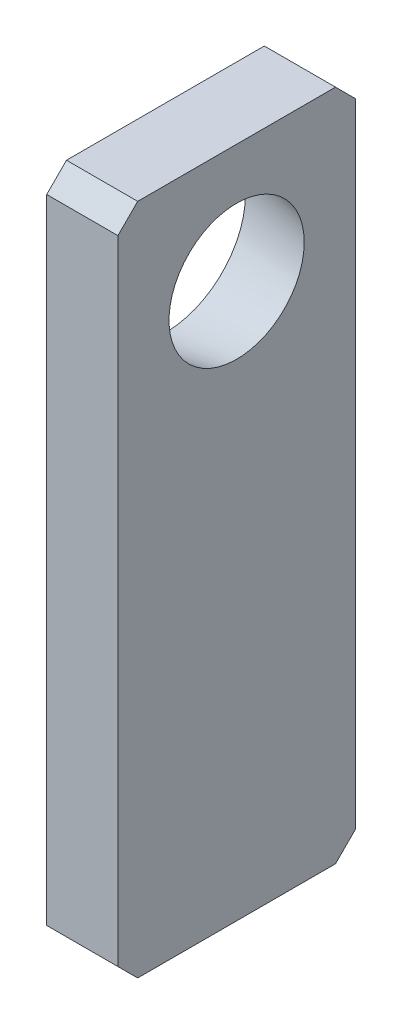
ISO-10303-21;
HEADER;
FILE_DESCRIPTION(('STEP AP214'),'2;1');
FILE_NAME('part.step','',(''),(''),'','','');
FILE_SCHEMA(('AUTOMOTIVE_DESIGN { 1 0 10303 214 1 1 1 1 }'));
ENDSEC;
DATA;
#1=APPLICATION_CONTEXT('core data for automotive mechanical design processes');
#2=APPLICATION_PROTOCOL_DEFINITION('international standard','automotive_design',2000,#1);
#3=PRODUCT_CONTEXT('',#1,'mechanical');
#4=PRODUCT('Part','Part','',(#3));
#5=PRODUCT_RELATED_PRODUCT_CATEGORY('part','',(#4));
#6=PRODUCT_DEFINITION_FORMATION('','',#4);
#7=PRODUCT_DEFINITION_CONTEXT('part definition',#1,'design');
#8=PRODUCT_DEFINITION('design','',#6,#7);
#9=PRODUCT_DEFINITION_SHAPE('','',#8);
#10=(LENGTH_UNIT() NAMED_UNIT(*) SI_UNIT(.MILLI.,.METRE.));
#11=(NAMED_UNIT(*) PLANE_ANGLE_UNIT() SI_UNIT($,.RADIAN.));
#12=(NAMED_UNIT(*) SI_UNIT($,.STERADIAN.) SOLID_ANGLE_UNIT());
#13=UNCERTAINTY_MEASURE_WITH_UNIT(LENGTH_MEASURE(1.E-05),#10,'distance_accuracy_value','');
#14=(GEOMETRIC_REPRESENTATION_CONTEXT(3) GLOBAL_UNCERTAINTY_ASSIGNED_CONTEXT((#13)) GLOBAL_UNIT_ASSIGNED_CONTEXT((#10,
#11,#12)) REPRESENTATION_CONTEXT('',''));
#15=CARTESIAN_POINT('',(0.,0.,0.));
#16=DIRECTION('',(0.,0.,1.));
#17=DIRECTION('',(1.,0.,0.));
#18=AXIS2_PLACEMENT_3D('',#15,#16,#17);
#19=CARTESIAN_POINT('',(-4.5,37.5,-7.5));
#20=DIRECTION('',(0.,0.,-1.));
#21=DIRECTION('',(0.,1.,0.));
#22=AXIS2_PLACEMENT_3D('',#19,#20,#21);
#23=PLANE('',#22);
#24=DIRECTION('',(0.,1.,0.));
#25=VECTOR('',#24,1.);
#26=CARTESIAN_POINT('',(0.,37.5,-7.5));
#27=LINE('',#26,#25);
#28=CARTESIAN_POINT('',(0.,-3.74999999999999,-7.5));
#29=VERTEX_POINT('',#28);
#30=CARTESIAN_POINT('',(0.,36.25,-7.5));
#31=VERTEX_POINT('',#30);
#32=EDGE_CURVE('E165',#29,#31,#27,.T.);
#33=ORIENTED_EDGE('',*,*,#32,.F.);
#34=DIRECTION('',(-1.,0.,0.));
#35=VECTOR('',#34,1.);
#36=CARTESIAN_POINT('',(-4.5,-3.74999999999999,-7.5));
#37=LINE('',#36,#35);
#38=CARTESIAN_POINT('',(-4.5,-3.74999999999999,-7.5));
#39=VERTEX_POINT('',#38);
#40=EDGE_CURVE('E161',#29,#39,#37,.T.);
#41=ORIENTED_EDGE('',*,*,#40,.T.);
#42=DIRECTION('',(0.,1.,0.));
#43=VECTOR('',#42,1.);
#44=CARTESIAN_POINT('',(-4.5,37.5,-7.5));
#45=LINE('',#44,#43);
#46=CARTESIAN_POINT('',(-4.5,36.25,-7.5));
#47=VERTEX_POINT('',#46);
#48=EDGE_CURVE('E228',#39,#47,#45,.T.);
#49=ORIENTED_EDGE('',*,*,#48,.T.);
#50=DIRECTION('',(1.,0.,0.));
#51=VECTOR('',#50,1.);
#52=CARTESIAN_POINT('',(-4.5,36.25,-7.5));
#53=LINE('',#52,#51);
#54=EDGE_CURVE('E158',#47,#31,#53,.T.);
#55=ORIENTED_EDGE('',*,*,#54,.T.);
#56=EDGE_LOOP('',(#33,#41,#49,#55));
#57=FACE_BOUND('',#56,.T.);
#58=ADVANCED_FACE('F45',(#57),#23,.T.);
#59=CARTESIAN_POINT('',(-4.5,-5.,7.5));
#60=DIRECTION('',(0.,-1.,0.));
#61=DIRECTION('',(0.,0.,-1.));
#62=AXIS2_PLACEMENT_3D('',#59,#60,#61);
#63=PLANE('',#62);
#64=DIRECTION('',(0.,0.,-1.));
#65=VECTOR('',#64,1.);
#66=CARTESIAN_POINT('',(0.,-5.,0.));
#67=LINE('',#66,#65);
#68=CARTESIAN_POINT('',(0.,-5.,6.24999999999998));
#69=VERTEX_POINT('',#68);
#70=CARTESIAN_POINT('',(0.,-5.,-6.25));
#71=VERTEX_POINT('',#70);
#72=EDGE_CURVE('E131',#69,#71,#67,.T.);
#73=ORIENTED_EDGE('',*,*,#72,.F.);
#74=DIRECTION('',(-1.,0.,0.));
#75=VECTOR('',#74,1.);
#76=CARTESIAN_POINT('',(-4.5,-5.,6.24999999999998));
#77=LINE('',#76,#75);
#78=CARTESIAN_POINT('',(-4.5,-5.,6.24999999999998));
#79=VERTEX_POINT('',#78);
#80=EDGE_CURVE('E149',#69,#79,#77,.T.);
#81=ORIENTED_EDGE('',*,*,#80,.T.);
#82=DIRECTION('',(0.,0.,-1.));
#83=VECTOR('',#82,1.);
#84=CARTESIAN_POINT('',(-4.5,-5.,0.));
#85=LINE('',#84,#83);
#86=CARTESIAN_POINT('',(-4.5,-5.,-6.25));
#87=VERTEX_POINT('',#86);
#88=EDGE_CURVE('E134',#79,#87,#85,.T.);
#89=ORIENTED_EDGE('',*,*,#88,.T.);
#90=DIRECTION('',(1.,0.,0.));
#91=VECTOR('',#90,1.);
#92=CARTESIAN_POINT('',(-4.5,-5.,-6.25));
#93=LINE('',#92,#91);
#94=EDGE_CURVE('E146',#87,#71,#93,.T.);
#95=ORIENTED_EDGE('',*,*,#94,.T.);
#96=EDGE_LOOP('',(#73,#81,#89,#95));
#97=FACE_BOUND('',#96,.T.);
#98=ADVANCED_FACE('F186',(#97),#63,.T.);
#99=CARTESIAN_POINT('',(-4.5,37.5,7.5));
#100=DIRECTION('',(0.,0.,1.));
#101=DIRECTION('',(0.,-1.,0.));
#102=AXIS2_PLACEMENT_3D('',#99,#100,#101);
#103=PLANE('',#102);
#104=DIRECTION('',(0.,-1.,0.));
#105=VECTOR('',#104,1.);
#106=CARTESIAN_POINT('',(-4.5,37.5,7.5));
#107=LINE('',#106,#105);
#108=CARTESIAN_POINT('',(-4.5,36.25,7.5));
#109=VERTEX_POINT('',#108);
#110=CARTESIAN_POINT('',(-4.5,-3.74999999999999,7.5));
#111=VERTEX_POINT('',#110);
#112=EDGE_CURVE('E138',#109,#111,#107,.T.);
#113=ORIENTED_EDGE('',*,*,#112,.T.);
#114=DIRECTION('',(1.,0.,0.));
#115=VECTOR('',#114,1.);
#116=CARTESIAN_POINT('',(-4.5,-3.74999999999999,7.5));
#117=LINE('',#116,#115);
#118=CARTESIAN_POINT('',(0.,-3.74999999999999,7.5));
#119=VERTEX_POINT('',#118);
#120=EDGE_CURVE('E130',#111,#119,#117,.T.);
#121=ORIENTED_EDGE('',*,*,#120,.T.);
#122=DIRECTION('',(0.,-1.,0.));
#123=VECTOR('',#122,1.);
#124=CARTESIAN_POINT('',(0.,37.5,7.5));
#125=LINE('',#124,#123);
#126=CARTESIAN_POINT('',(0.,36.25,7.5));
#127=VERTEX_POINT('',#126);
#128=EDGE_CURVE('E116',#127,#119,#125,.T.);
#129=ORIENTED_EDGE('',*,*,#128,.F.);
#130=DIRECTION('',(-1.,0.,0.));
#131=VECTOR('',#130,1.);
#132=CARTESIAN_POINT('',(-4.5,36.25,7.5));
#133=LINE('',#132,#131);
#134=EDGE_CURVE('E128',#127,#109,#133,.T.);
#135=ORIENTED_EDGE('',*,*,#134,.T.);
#136=EDGE_LOOP('',(#113,#121,#129,#135));
#137=FACE_BOUND('',#136,.T.);
#138=ADVANCED_FACE('F127',(#137),#103,.T.);
#139=CARTESIAN_POINT('',(-4.5,37.5,7.5));
#140=DIRECTION('',(0.,1.,0.));
#141=DIRECTION('',(0.,0.,1.));
#142=AXIS2_PLACEMENT_3D('',#139,#140,#141);
#143=PLANE('',#142);
#144=DIRECTION('',(0.,0.,1.));
#145=VECTOR('',#144,1.);
#146=CARTESIAN_POINT('',(-4.5,37.5,7.5));
#147=LINE('',#146,#145);
#148=CARTESIAN_POINT('',(-4.5,37.5,-6.25));
#149=VERTEX_POINT('',#148);
#150=CARTESIAN_POINT('',(-4.5,37.5,6.25));
#151=VERTEX_POINT('',#150);
#152=EDGE_CURVE('E230',#149,#151,#147,.T.);
#153=ORIENTED_EDGE('',*,*,#152,.T.);
#154=DIRECTION('',(1.,0.,0.));
#155=VECTOR('',#154,1.);
#156=CARTESIAN_POINT('',(-4.5,37.5,6.25));
#157=LINE('',#156,#155);
#158=CARTESIAN_POINT('',(0.,37.5,6.25));
#159=VERTEX_POINT('',#158);
#160=EDGE_CURVE('E12',#151,#159,#157,.T.);
#161=ORIENTED_EDGE('',*,*,#160,.T.);
#162=DIRECTION('',(0.,0.,1.));
#163=VECTOR('',#162,1.);
#164=CARTESIAN_POINT('',(0.,37.5,7.5));
#165=LINE('',#164,#163);
#166=CARTESIAN_POINT('',(0.,37.5,-6.25));
#167=VERTEX_POINT('',#166);
#168=EDGE_CURVE('E117',#167,#159,#165,.T.);
#169=ORIENTED_EDGE('',*,*,#168,.F.);
#170=DIRECTION('',(-1.,0.,0.));
#171=VECTOR('',#170,1.);
#172=CARTESIAN_POINT('',(-4.5,37.5,-6.25));
#173=LINE('',#172,#171);
#174=EDGE_CURVE('E54',#167,#149,#173,.T.);
#175=ORIENTED_EDGE('',*,*,#174,.T.);
#176=EDGE_LOOP('',(#153,#161,#169,#175));
#177=FACE_BOUND('',#176,.T.);
#178=ADVANCED_FACE('F182',(#177),#143,.T.);
#179=CARTESIAN_POINT('',(-4.5,0.,0.));
#180=DIRECTION('',(1.,0.,0.));
#181=DIRECTION('',(0.,0.,-1.));
#182=AXIS2_PLACEMENT_3D('',#179,#180,#181);
#183=PLANE('',#182);
#184=ORIENTED_EDGE('',*,*,#88,.F.);
#185=DIRECTION('',(0.,-0.707106781186546,-0.707106781186549));
#186=VECTOR('',#185,1.);
#187=CARTESIAN_POINT('',(-4.5,-3.74999999999999,7.5));
#188=LINE('',#187,#186);
#189=EDGE_CURVE('E156',#79,#111,#188,.F.);
#190=ORIENTED_EDGE('',*,*,#189,.T.);
#191=ORIENTED_EDGE('',*,*,#112,.F.);
#192=DIRECTION('',(0.,-0.707106781186549,0.707106781186546));
#193=VECTOR('',#192,1.);
#194=CARTESIAN_POINT('',(-4.5,37.5,6.25));
#195=LINE('',#194,#193);
#196=EDGE_CURVE('E62',#109,#151,#195,.F.);
#197=ORIENTED_EDGE('',*,*,#196,.T.);
#198=ORIENTED_EDGE('',*,*,#152,.F.);
#199=DIRECTION('',(0.,0.707106781186546,0.707106781186549));
#200=VECTOR('',#199,1.);
#201=CARTESIAN_POINT('',(-4.5,36.25,-7.5));
#202=LINE('',#201,#200);
#203=EDGE_CURVE('E151',#149,#47,#202,.F.);
#204=ORIENTED_EDGE('',*,*,#203,.T.);
#205=ORIENTED_EDGE('',*,*,#48,.F.);
#206=DIRECTION('',(0.,0.70710678118655,-0.707106781186545));
#207=VECTOR('',#206,1.);
#208=CARTESIAN_POINT('',(-4.5,-5.,-6.25));
#209=LINE('',#208,#207);
#210=EDGE_CURVE('E154',#39,#87,#209,.F.);
#211=ORIENTED_EDGE('',*,*,#210,.T.);
#212=EDGE_LOOP('',(#184,#190,#191,#197,#198,#204,#205,#211));
#213=FACE_BOUND('',#212,.T.);
#214=CARTESIAN_POINT('',(-4.5,30.,0.));
#215=DIRECTION('',(1.,0.,0.));
#216=DIRECTION('',(0.,0.,-1.));
#217=AXIS2_PLACEMENT_3D('',#214,#215,#216);
#218=CIRCLE('',#217,5.06415050142863);
#219=CARTESIAN_POINT('',(-4.5,30.,-5.06415050142863));
#220=VERTEX_POINT('',#219);
#221=EDGE_CURVE('E163',#220,#220,#218,.F.);
#222=ORIENTED_EDGE('',*,*,#221,.F.);
#223=EDGE_LOOP('',(#222));
#224=FACE_BOUND('',#223,.T.);
#225=ADVANCED_FACE('F175',(#213,#224),#183,.F.);
#226=CARTESIAN_POINT('',(0.,0.,0.));
#227=DIRECTION('',(1.,0.,0.));
#228=DIRECTION('',(0.,0.,-1.));
#229=AXIS2_PLACEMENT_3D('',#226,#227,#228);
#230=PLANE('',#229);
#231=CARTESIAN_POINT('',(0.,30.,0.));
#232=DIRECTION('',(1.,0.,0.));
#233=DIRECTION('',(0.,0.,-1.));
#234=AXIS2_PLACEMENT_3D('',#231,#232,#233);
#235=CIRCLE('',#234,4.27067908824053);
#236=CARTESIAN_POINT('',(0.,30.,-4.27067908824053));
#237=VERTEX_POINT('',#236);
#238=EDGE_CURVE('E49',#237,#237,#235,.T.);
#239=ORIENTED_EDGE('',*,*,#238,.F.);
#240=EDGE_LOOP('',(#239));
#241=FACE_BOUND('',#240,.T.);
#242=ORIENTED_EDGE('',*,*,#128,.T.);
#243=DIRECTION('',(0.,0.707106781186546,0.707106781186549));
#244=VECTOR('',#243,1.);
#245=CARTESIAN_POINT('',(0.,-5.625,5.62499999999998));
#246=LINE('',#245,#244);
#247=EDGE_CURVE('E144',#119,#69,#246,.F.);
#248=ORIENTED_EDGE('',*,*,#247,.T.);
#249=ORIENTED_EDGE('',*,*,#72,.T.);
#250=DIRECTION('',(0.,-0.70710678118655,0.707106781186545));
#251=VECTOR('',#250,1.);
#252=CARTESIAN_POINT('',(0.,-5.62499999999998,-5.62500000000003));
#253=LINE('',#252,#251);
#254=EDGE_CURVE('E121',#71,#29,#253,.F.);
#255=ORIENTED_EDGE('',*,*,#254,.T.);
#256=ORIENTED_EDGE('',*,*,#32,.T.);
#257=DIRECTION('',(0.,-0.707106781186546,-0.707106781186549));
#258=VECTOR('',#257,1.);
#259=CARTESIAN_POINT('',(0.,21.8750000000001,-21.875));
#260=LINE('',#259,#258);
#261=EDGE_CURVE('E122',#31,#167,#260,.F.);
#262=ORIENTED_EDGE('',*,*,#261,.T.);
#263=ORIENTED_EDGE('',*,*,#168,.T.);
#264=DIRECTION('',(0.,0.707106781186549,-0.707106781186546));
#265=VECTOR('',#264,1.);
#266=CARTESIAN_POINT('',(0.,21.8749999999999,21.875));
#267=LINE('',#266,#265);
#268=EDGE_CURVE('E113',#159,#127,#267,.F.);
#269=ORIENTED_EDGE('',*,*,#268,.T.);
#270=EDGE_LOOP('',(#242,#248,#249,#255,#256,#262,#263,#269));
#271=FACE_BOUND('',#270,.T.);
#272=ADVANCED_FACE('F115',(#241,#271),#230,.T.);
#273=CARTESIAN_POINT('',(-4.97395277334996,30.,0.));
#274=DIRECTION('',(-1.,0.,0.));
#275=DIRECTION('',(0.,0.,-1.));
#276=AXIS2_PLACEMENT_3D('',#273,#274,#275);
#277=CONICAL_SURFACE('',#276,5.14772116295183,0.174532925199433);
#278=ORIENTED_EDGE('',*,*,#221,.T.);
#279=EDGE_LOOP('',(#278));
#280=FACE_BOUND('',#279,.T.);
#281=ORIENTED_EDGE('',*,*,#238,.T.);
#282=EDGE_LOOP('',(#281));
#283=FACE_BOUND('',#282,.T.);
#284=ADVANCED_FACE('F47',(#280,#283),#277,.F.);
#285=CARTESIAN_POINT('',(-4.5,-3.74999999999999,7.5));
#286=DIRECTION('',(0.,0.707106781186549,-0.707106781186546));
#287=DIRECTION('',(1.,0.,0.));
#288=AXIS2_PLACEMENT_3D('',#285,#286,#287);
#289=PLANE('',#288);
#290=ORIENTED_EDGE('',*,*,#189,.F.);
#291=ORIENTED_EDGE('',*,*,#80,.F.);
#292=ORIENTED_EDGE('',*,*,#247,.F.);
#293=ORIENTED_EDGE('',*,*,#120,.F.);
#294=EDGE_LOOP('',(#290,#291,#292,#293));
#295=FACE_BOUND('',#294,.T.);
#296=ADVANCED_FACE('F181',(#295),#289,.F.);
#297=CARTESIAN_POINT('',(-4.5,-5.,-6.25));
#298=DIRECTION('',(0.,0.707106781186545,0.70710678118655));
#299=DIRECTION('',(1.,0.,0.));
#300=AXIS2_PLACEMENT_3D('',#297,#298,#299);
#301=PLANE('',#300);
#302=ORIENTED_EDGE('',*,*,#210,.F.);
#303=ORIENTED_EDGE('',*,*,#40,.F.);
#304=ORIENTED_EDGE('',*,*,#254,.F.);
#305=ORIENTED_EDGE('',*,*,#94,.F.);
#306=EDGE_LOOP('',(#302,#303,#304,#305));
#307=FACE_BOUND('',#306,.T.);
#308=ADVANCED_FACE('F203',(#307),#301,.F.);
#309=CARTESIAN_POINT('',(-4.5,37.5,6.25));
#310=DIRECTION('',(0.,-0.707106781186545,-0.707106781186549));
#311=DIRECTION('',(1.,0.,0.));
#312=AXIS2_PLACEMENT_3D('',#309,#310,#311);
#313=PLANE('',#312);
#314=ORIENTED_EDGE('',*,*,#196,.F.);
#315=ORIENTED_EDGE('',*,*,#134,.F.);
#316=ORIENTED_EDGE('',*,*,#268,.F.);
#317=ORIENTED_EDGE('',*,*,#160,.F.);
#318=EDGE_LOOP('',(#314,#315,#316,#317));
#319=FACE_BOUND('',#318,.T.);
#320=ADVANCED_FACE('F133',(#319),#313,.F.);
#321=CARTESIAN_POINT('',(-4.5,36.25,-7.5));
#322=DIRECTION('',(0.,-0.707106781186549,0.707106781186546));
#323=DIRECTION('',(1.,0.,0.));
#324=AXIS2_PLACEMENT_3D('',#321,#322,#323);
#325=PLANE('',#324);
#326=ORIENTED_EDGE('',*,*,#203,.F.);
#327=ORIENTED_EDGE('',*,*,#174,.F.);
#328=ORIENTED_EDGE('',*,*,#261,.F.);
#329=ORIENTED_EDGE('',*,*,#54,.F.);
#330=EDGE_LOOP('',(#326,#327,#328,#329));
#331=FACE_BOUND('',#330,.T.);
#332=ADVANCED_FACE('F215',(#331),#325,.F.);
#333=CLOSED_SHELL('',(#58,#98,#138,#178,#225,#272,#284,#296,#308,#320,#332));
#334=MANIFOLD_SOLID_BREP('B2',#333);
#335=ADVANCED_BREP_SHAPE_REPRESENTATION('',(#18,#334),#14);
#336=SHAPE_DEFINITION_REPRESENTATION(#9,#335);
ENDSEC;
END-ISO-10303-21;
